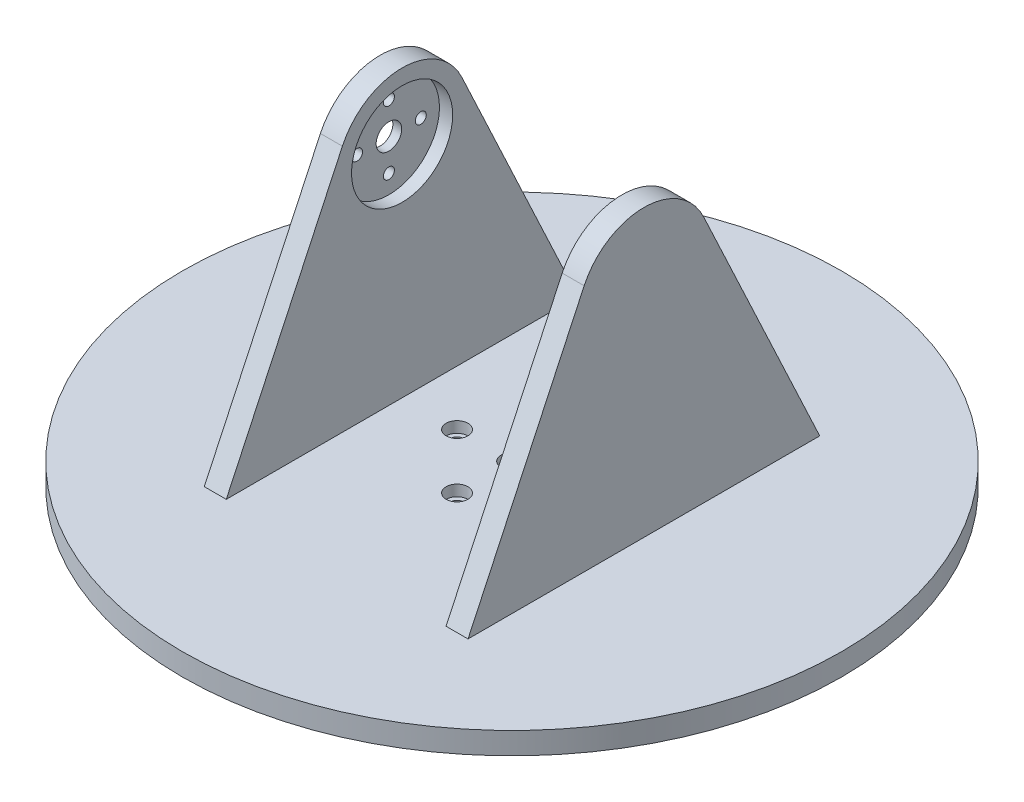
ISO-10303-21;
HEADER;
FILE_DESCRIPTION(('STEP AP214'),'2;1');
FILE_NAME('part.step','',(''),(''),'','','');
FILE_SCHEMA(('AUTOMOTIVE_DESIGN { 1 0 10303 214 1 1 1 1 }'));
ENDSEC;
DATA;
#1=APPLICATION_CONTEXT('core data for automotive mechanical design processes');
#2=APPLICATION_PROTOCOL_DEFINITION('international standard','automotive_design',2000,#1);
#3=PRODUCT_CONTEXT('',#1,'mechanical');
#4=PRODUCT('Part','Part','',(#3));
#5=PRODUCT_RELATED_PRODUCT_CATEGORY('part','',(#4));
#6=PRODUCT_DEFINITION_FORMATION('','',#4);
#7=PRODUCT_DEFINITION_CONTEXT('part definition',#1,'design');
#8=PRODUCT_DEFINITION('design','',#6,#7);
#9=PRODUCT_DEFINITION_SHAPE('','',#8);
#10=(LENGTH_UNIT() NAMED_UNIT(*) SI_UNIT(.MILLI.,.METRE.));
#11=(NAMED_UNIT(*) PLANE_ANGLE_UNIT() SI_UNIT($,.RADIAN.));
#12=(NAMED_UNIT(*) SI_UNIT($,.STERADIAN.) SOLID_ANGLE_UNIT());
#13=UNCERTAINTY_MEASURE_WITH_UNIT(LENGTH_MEASURE(1.E-05),#10,'distance_accuracy_value','');
#14=(GEOMETRIC_REPRESENTATION_CONTEXT(3) GLOBAL_UNCERTAINTY_ASSIGNED_CONTEXT((#13)) GLOBAL_UNIT_ASSIGNED_CONTEXT((#10,
#11,#12)) REPRESENTATION_CONTEXT('',''));
#15=CARTESIAN_POINT('',(0.,0.,0.));
#16=DIRECTION('',(0.,0.,1.));
#17=DIRECTION('',(1.,0.,0.));
#18=AXIS2_PLACEMENT_3D('',#15,#16,#17);
#19=CARTESIAN_POINT('',(-27.5,55.,0.));
#20=DIRECTION('',(-1.,0.,0.));
#21=DIRECTION('',(0.,0.,1.));
#22=AXIS2_PLACEMENT_3D('',#19,#20,#21);
#23=CYLINDRICAL_SURFACE('',#22,2.9);
#24=CARTESIAN_POINT('',(-30.,55.,0.));
#25=DIRECTION('',(-1.,0.,0.));
#26=DIRECTION('',(0.,0.,1.));
#27=AXIS2_PLACEMENT_3D('',#24,#25,#26);
#28=CIRCLE('',#27,2.9);
#29=CARTESIAN_POINT('',(-30.,55.,2.9));
#30=VERTEX_POINT('',#29);
#31=EDGE_CURVE('E133',#30,#30,#28,.T.);
#32=ORIENTED_EDGE('',*,*,#31,.T.);
#33=EDGE_LOOP('',(#32));
#34=FACE_BOUND('',#33,.T.);
#35=CARTESIAN_POINT('',(-28.,55.,0.));
#36=DIRECTION('',(1.,0.,0.));
#37=DIRECTION('',(0.,0.,-1.));
#38=AXIS2_PLACEMENT_3D('',#35,#36,#37);
#39=CIRCLE('',#38,2.9);
#40=CARTESIAN_POINT('',(-28.,55.,-2.9));
#41=VERTEX_POINT('',#40);
#42=EDGE_CURVE('E206',#41,#41,#39,.F.);
#43=ORIENTED_EDGE('',*,*,#42,.F.);
#44=EDGE_LOOP('',(#43));
#45=FACE_BOUND('',#44,.T.);
#46=ADVANCED_FACE('F39',(#34,#45),#23,.F.);
#47=CARTESIAN_POINT('',(-27.,62.25,0.));
#48=DIRECTION('',(-1.,0.,0.));
#49=DIRECTION('',(0.,0.,1.));
#50=AXIS2_PLACEMENT_3D('',#47,#48,#49);
#51=CYLINDRICAL_SURFACE('',#50,1.25);
#52=CARTESIAN_POINT('',(-30.,62.25,0.));
#53=DIRECTION('',(-1.,0.,0.));
#54=DIRECTION('',(0.,0.,1.));
#55=AXIS2_PLACEMENT_3D('',#52,#53,#54);
#56=CIRCLE('',#55,1.25);
#57=CARTESIAN_POINT('',(-30.,62.25,1.25));
#58=VERTEX_POINT('',#57);
#59=EDGE_CURVE('E247',#58,#58,#56,.T.);
#60=ORIENTED_EDGE('',*,*,#59,.T.);
#61=EDGE_LOOP('',(#60));
#62=FACE_BOUND('',#61,.T.);
#63=CARTESIAN_POINT('',(-28.,62.25,0.));
#64=DIRECTION('',(1.,0.,0.));
#65=DIRECTION('',(0.,0.,-1.));
#66=AXIS2_PLACEMENT_3D('',#63,#64,#65);
#67=CIRCLE('',#66,1.25);
#68=CARTESIAN_POINT('',(-28.,62.25,-1.25));
#69=VERTEX_POINT('',#68);
#70=EDGE_CURVE('E554',#69,#69,#67,.F.);
#71=ORIENTED_EDGE('',*,*,#70,.F.);
#72=EDGE_LOOP('',(#71));
#73=FACE_BOUND('',#72,.T.);
#74=ADVANCED_FACE('F296',(#62,#73),#51,.F.);
#75=CARTESIAN_POINT('',(-27.,55.,-7.25));
#76=DIRECTION('',(-1.,0.,0.));
#77=DIRECTION('',(0.,0.,1.));
#78=AXIS2_PLACEMENT_3D('',#75,#76,#77);
#79=CYLINDRICAL_SURFACE('',#78,1.25);
#80=CARTESIAN_POINT('',(-30.,55.,-7.25));
#81=DIRECTION('',(-1.,0.,0.));
#82=DIRECTION('',(0.,1.,0.));
#83=AXIS2_PLACEMENT_3D('',#80,#81,#82);
#84=CIRCLE('',#83,1.25);
#85=CARTESIAN_POINT('',(-30.,56.25,-7.25));
#86=VERTEX_POINT('',#85);
#87=EDGE_CURVE('E244',#86,#86,#84,.T.);
#88=ORIENTED_EDGE('',*,*,#87,.T.);
#89=EDGE_LOOP('',(#88));
#90=FACE_BOUND('',#89,.T.);
#91=CARTESIAN_POINT('',(-28.,55.,-7.25));
#92=DIRECTION('',(1.,0.,0.));
#93=DIRECTION('',(0.,0.,-1.));
#94=AXIS2_PLACEMENT_3D('',#91,#92,#93);
#95=CIRCLE('',#94,1.25);
#96=CARTESIAN_POINT('',(-28.,55.,-8.5));
#97=VERTEX_POINT('',#96);
#98=EDGE_CURVE('E551',#97,#97,#95,.F.);
#99=ORIENTED_EDGE('',*,*,#98,.F.);
#100=EDGE_LOOP('',(#99));
#101=FACE_BOUND('',#100,.T.);
#102=ADVANCED_FACE('F302',(#90,#101),#79,.F.);
#103=CARTESIAN_POINT('',(-27.,47.75,0.));
#104=DIRECTION('',(-1.,0.,0.));
#105=DIRECTION('',(0.,0.,1.));
#106=AXIS2_PLACEMENT_3D('',#103,#104,#105);
#107=CYLINDRICAL_SURFACE('',#106,1.25);
#108=CARTESIAN_POINT('',(-30.,47.75,0.));
#109=DIRECTION('',(-1.,0.,0.));
#110=DIRECTION('',(0.,0.,-1.));
#111=AXIS2_PLACEMENT_3D('',#108,#109,#110);
#112=CIRCLE('',#111,1.25);
#113=CARTESIAN_POINT('',(-30.,47.75,-1.25));
#114=VERTEX_POINT('',#113);
#115=EDGE_CURVE('E248',#114,#114,#112,.T.);
#116=ORIENTED_EDGE('',*,*,#115,.T.);
#117=EDGE_LOOP('',(#116));
#118=FACE_BOUND('',#117,.T.);
#119=CARTESIAN_POINT('',(-28.,47.75,0.));
#120=DIRECTION('',(1.,0.,0.));
#121=DIRECTION('',(0.,0.,-1.));
#122=AXIS2_PLACEMENT_3D('',#119,#120,#121);
#123=CIRCLE('',#122,1.25);
#124=CARTESIAN_POINT('',(-28.,47.75,-1.25));
#125=VERTEX_POINT('',#124);
#126=EDGE_CURVE('E549',#125,#125,#123,.F.);
#127=ORIENTED_EDGE('',*,*,#126,.F.);
#128=EDGE_LOOP('',(#127));
#129=FACE_BOUND('',#128,.T.);
#130=ADVANCED_FACE('F496',(#118,#129),#107,.F.);
#131=CARTESIAN_POINT('',(-27.,55.0000000000001,7.25));
#132=DIRECTION('',(-1.,0.,0.));
#133=DIRECTION('',(0.,0.,1.));
#134=AXIS2_PLACEMENT_3D('',#131,#132,#133);
#135=CYLINDRICAL_SURFACE('',#134,1.25);
#136=CARTESIAN_POINT('',(-30.,55.0000000000001,7.25));
#137=DIRECTION('',(-1.,0.,0.));
#138=DIRECTION('',(0.,-1.,0.));
#139=AXIS2_PLACEMENT_3D('',#136,#137,#138);
#140=CIRCLE('',#139,1.25);
#141=CARTESIAN_POINT('',(-30.,53.7500000000001,7.25000000000001));
#142=VERTEX_POINT('',#141);
#143=EDGE_CURVE('E242',#142,#142,#140,.T.);
#144=ORIENTED_EDGE('',*,*,#143,.T.);
#145=EDGE_LOOP('',(#144));
#146=FACE_BOUND('',#145,.T.);
#147=CARTESIAN_POINT('',(-28.,55.0000000000001,7.25));
#148=DIRECTION('',(1.,0.,0.));
#149=DIRECTION('',(0.,0.,-1.));
#150=AXIS2_PLACEMENT_3D('',#147,#148,#149);
#151=CIRCLE('',#150,1.25);
#152=CARTESIAN_POINT('',(-28.,55.0000000000001,6.));
#153=VERTEX_POINT('',#152);
#154=EDGE_CURVE('E43',#153,#153,#151,.F.);
#155=ORIENTED_EDGE('',*,*,#154,.F.);
#156=EDGE_LOOP('',(#155));
#157=FACE_BOUND('',#156,.T.);
#158=ADVANCED_FACE('F465',(#146,#157),#135,.F.);
#159=CARTESIAN_POINT('',(0.,0.,0.));
#160=DIRECTION('',(0.,1.,0.));
#161=DIRECTION('',(0.,0.,1.));
#162=AXIS2_PLACEMENT_3D('',#159,#160,#161);
#163=CYLINDRICAL_SURFACE('',#162,1.5);
#164=CARTESIAN_POINT('',(0.,0.,0.));
#165=DIRECTION('',(0.,1.,0.));
#166=DIRECTION('',(0.,0.,1.));
#167=AXIS2_PLACEMENT_3D('',#164,#165,#166);
#168=CIRCLE('',#167,1.5);
#169=CARTESIAN_POINT('',(0.,0.,1.5));
#170=VERTEX_POINT('',#169);
#171=EDGE_CURVE('E241',#170,#170,#168,.T.);
#172=ORIENTED_EDGE('',*,*,#171,.F.);
#173=EDGE_LOOP('',(#172));
#174=FACE_BOUND('',#173,.T.);
#175=CARTESIAN_POINT('',(0.,2.5,0.));
#176=DIRECTION('',(0.,1.,0.));
#177=DIRECTION('',(0.,0.,1.));
#178=AXIS2_PLACEMENT_3D('',#175,#176,#177);
#179=CIRCLE('',#178,1.5);
#180=CARTESIAN_POINT('',(0.,2.5,1.5));
#181=VERTEX_POINT('',#180);
#182=EDGE_CURVE('E195',#181,#181,#179,.F.);
#183=ORIENTED_EDGE('',*,*,#182,.F.);
#184=EDGE_LOOP('',(#183));
#185=FACE_BOUND('',#184,.T.);
#186=ADVANCED_FACE('F389',(#174,#185),#163,.F.);
#187=CARTESIAN_POINT('',(12.5,0.,-1.30930550206618E-13));
#188=DIRECTION('',(0.,1.,0.));
#189=DIRECTION('',(0.,0.,1.));
#190=AXIS2_PLACEMENT_3D('',#187,#188,#189);
#191=CYLINDRICAL_SURFACE('',#190,1.5);
#192=CARTESIAN_POINT('',(12.5,0.,-1.30930550206618E-13));
#193=DIRECTION('',(0.,1.,0.));
#194=DIRECTION('',(-1.,0.,0.));
#195=AXIS2_PLACEMENT_3D('',#192,#193,#194);
#196=CIRCLE('',#195,1.5);
#197=CARTESIAN_POINT('',(11.,0.,-1.15218884181823E-13));
#198=VERTEX_POINT('',#197);
#199=EDGE_CURVE('E181',#198,#198,#196,.T.);
#200=ORIENTED_EDGE('',*,*,#199,.F.);
#201=EDGE_LOOP('',(#200));
#202=FACE_BOUND('',#201,.T.);
#203=CARTESIAN_POINT('',(12.5,2.5,-1.30930550206618E-13));
#204=DIRECTION('',(0.,1.,0.));
#205=DIRECTION('',(0.,0.,1.));
#206=AXIS2_PLACEMENT_3D('',#203,#204,#205);
#207=CIRCLE('',#206,1.5);
#208=CARTESIAN_POINT('',(12.5,2.5,1.49999999999987));
#209=VERTEX_POINT('',#208);
#210=EDGE_CURVE('E188',#209,#209,#207,.F.);
#211=ORIENTED_EDGE('',*,*,#210,.F.);
#212=EDGE_LOOP('',(#211));
#213=FACE_BOUND('',#212,.T.);
#214=ADVANCED_FACE('F382',(#202,#213),#191,.F.);
#215=CARTESIAN_POINT('',(0.,0.,12.5));
#216=DIRECTION('',(0.,1.,0.));
#217=DIRECTION('',(0.,0.,1.));
#218=AXIS2_PLACEMENT_3D('',#215,#216,#217);
#219=CYLINDRICAL_SURFACE('',#218,1.5);
#220=CARTESIAN_POINT('',(0.,0.,12.5));
#221=DIRECTION('',(0.,1.,0.));
#222=DIRECTION('',(0.,0.,-1.));
#223=AXIS2_PLACEMENT_3D('',#220,#221,#222);
#224=CIRCLE('',#223,1.5);
#225=CARTESIAN_POINT('',(0.,0.,11.));
#226=VERTEX_POINT('',#225);
#227=EDGE_CURVE('E234',#226,#226,#224,.T.);
#228=ORIENTED_EDGE('',*,*,#227,.F.);
#229=EDGE_LOOP('',(#228));
#230=FACE_BOUND('',#229,.T.);
#231=CARTESIAN_POINT('',(0.,2.5,12.5));
#232=DIRECTION('',(0.,1.,0.));
#233=DIRECTION('',(0.,0.,1.));
#234=AXIS2_PLACEMENT_3D('',#231,#232,#233);
#235=CIRCLE('',#234,1.5);
#236=CARTESIAN_POINT('',(0.,2.5,14.));
#237=VERTEX_POINT('',#236);
#238=EDGE_CURVE('E187',#237,#237,#235,.F.);
#239=ORIENTED_EDGE('',*,*,#238,.F.);
#240=EDGE_LOOP('',(#239));
#241=FACE_BOUND('',#240,.T.);
#242=ADVANCED_FACE('F383',(#230,#241),#219,.F.);
#243=CARTESIAN_POINT('',(-12.5,0.,0.));
#244=DIRECTION('',(0.,1.,0.));
#245=DIRECTION('',(0.,0.,1.));
#246=AXIS2_PLACEMENT_3D('',#243,#244,#245);
#247=CYLINDRICAL_SURFACE('',#246,1.5);
#248=CARTESIAN_POINT('',(-12.5,0.,0.));
#249=DIRECTION('',(0.,1.,0.));
#250=DIRECTION('',(1.,0.,0.));
#251=AXIS2_PLACEMENT_3D('',#248,#249,#250);
#252=CIRCLE('',#251,1.5);
#253=CARTESIAN_POINT('',(-11.,0.,0.));
#254=VERTEX_POINT('',#253);
#255=EDGE_CURVE('E229',#254,#254,#252,.T.);
#256=ORIENTED_EDGE('',*,*,#255,.F.);
#257=EDGE_LOOP('',(#256));
#258=FACE_BOUND('',#257,.T.);
#259=CARTESIAN_POINT('',(-12.5,2.5,0.));
#260=DIRECTION('',(0.,1.,0.));
#261=DIRECTION('',(0.,0.,1.));
#262=AXIS2_PLACEMENT_3D('',#259,#260,#261);
#263=CIRCLE('',#262,1.5);
#264=CARTESIAN_POINT('',(-12.5,2.5,1.50000000000004));
#265=VERTEX_POINT('',#264);
#266=EDGE_CURVE('E182',#265,#265,#263,.F.);
#267=ORIENTED_EDGE('',*,*,#266,.F.);
#268=EDGE_LOOP('',(#267));
#269=FACE_BOUND('',#268,.T.);
#270=ADVANCED_FACE('F356',(#258,#269),#247,.F.);
#271=CARTESIAN_POINT('',(0.,0.,-12.5));
#272=DIRECTION('',(0.,1.,0.));
#273=DIRECTION('',(0.,0.,1.));
#274=AXIS2_PLACEMENT_3D('',#271,#272,#273);
#275=CYLINDRICAL_SURFACE('',#274,1.5);
#276=CARTESIAN_POINT('',(0.,0.,-12.5));
#277=DIRECTION('',(0.,1.,0.));
#278=DIRECTION('',(0.,0.,1.));
#279=AXIS2_PLACEMENT_3D('',#276,#277,#278);
#280=CIRCLE('',#279,1.5);
#281=CARTESIAN_POINT('',(0.,0.,-11.));
#282=VERTEX_POINT('',#281);
#283=EDGE_CURVE('E231',#282,#282,#280,.T.);
#284=ORIENTED_EDGE('',*,*,#283,.F.);
#285=EDGE_LOOP('',(#284));
#286=FACE_BOUND('',#285,.T.);
#287=CARTESIAN_POINT('',(0.,2.5,-12.5));
#288=DIRECTION('',(0.,1.,0.));
#289=DIRECTION('',(0.,0.,1.));
#290=AXIS2_PLACEMENT_3D('',#287,#288,#289);
#291=CIRCLE('',#290,1.5);
#292=CARTESIAN_POINT('',(0.,2.5,-11.));
#293=VERTEX_POINT('',#292);
#294=EDGE_CURVE('E178',#293,#293,#291,.F.);
#295=ORIENTED_EDGE('',*,*,#294,.F.);
#296=EDGE_LOOP('',(#295));
#297=FACE_BOUND('',#296,.T.);
#298=ADVANCED_FACE('F352',(#286,#297),#275,.F.);
#299=CARTESIAN_POINT('',(0.,5.,0.));
#300=DIRECTION('',(0.,1.,0.));
#301=DIRECTION('',(0.,0.,1.));
#302=AXIS2_PLACEMENT_3D('',#299,#300,#301);
#303=PLANE('',#302);
#304=CARTESIAN_POINT('',(0.,5.,0.));
#305=DIRECTION('',(0.,1.,0.));
#306=DIRECTION('',(0.,0.,1.));
#307=AXIS2_PLACEMENT_3D('',#304,#305,#306);
#308=CIRCLE('',#307,2.46109226377191);
#309=CARTESIAN_POINT('',(0.,5.,2.46109226377191));
#310=VERTEX_POINT('',#309);
#311=EDGE_CURVE('E203',#310,#310,#308,.T.);
#312=ORIENTED_EDGE('',*,*,#311,.F.);
#313=EDGE_LOOP('',(#312));
#314=FACE_BOUND('',#313,.T.);
#315=CARTESIAN_POINT('',(-12.5,5.,0.));
#316=DIRECTION('',(0.,1.,0.));
#317=DIRECTION('',(1.,0.,0.));
#318=AXIS2_PLACEMENT_3D('',#315,#316,#317);
#319=CIRCLE('',#318,2.48826211207155);
#320=CARTESIAN_POINT('',(-10.0117378879285,5.,0.));
#321=VERTEX_POINT('',#320);
#322=EDGE_CURVE('E212',#321,#321,#319,.T.);
#323=ORIENTED_EDGE('',*,*,#322,.F.);
#324=EDGE_LOOP('',(#323));
#325=FACE_BOUND('',#324,.T.);
#326=CARTESIAN_POINT('',(0.,5.,12.5));
#327=DIRECTION('',(0.,1.,0.));
#328=DIRECTION('',(0.,0.,-1.));
#329=AXIS2_PLACEMENT_3D('',#326,#327,#328);
#330=CIRCLE('',#329,2.48826211207155);
#331=CARTESIAN_POINT('',(0.,5.,10.0117378879285));
#332=VERTEX_POINT('',#331);
#333=EDGE_CURVE('E221',#332,#332,#330,.T.);
#334=ORIENTED_EDGE('',*,*,#333,.F.);
#335=EDGE_LOOP('',(#334));
#336=FACE_BOUND('',#335,.T.);
#337=CARTESIAN_POINT('',(12.5,5.,-1.30930550206618E-13));
#338=DIRECTION('',(0.,1.,0.));
#339=DIRECTION('',(-1.,0.,0.));
#340=AXIS2_PLACEMENT_3D('',#337,#338,#339);
#341=CIRCLE('',#340,2.48826211207155);
#342=CARTESIAN_POINT('',(10.0117378879285,5.,-1.04867388015273E-13));
#343=VERTEX_POINT('',#342);
#344=EDGE_CURVE('E192',#343,#343,#341,.T.);
#345=ORIENTED_EDGE('',*,*,#344,.F.);
#346=EDGE_LOOP('',(#345));
#347=FACE_BOUND('',#346,.T.);
#348=CARTESIAN_POINT('',(0.,5.,-12.5));
#349=DIRECTION('',(0.,1.,0.));
#350=DIRECTION('',(0.,0.,1.));
#351=AXIS2_PLACEMENT_3D('',#348,#349,#350);
#352=CIRCLE('',#351,2.48826211207155);
#353=CARTESIAN_POINT('',(0.,5.,-10.0117378879285));
#354=VERTEX_POINT('',#353);
#355=EDGE_CURVE('E191',#354,#354,#352,.T.);
#356=ORIENTED_EDGE('',*,*,#355,.F.);
#357=EDGE_LOOP('',(#356));
#358=FACE_BOUND('',#357,.T.);
#359=CARTESIAN_POINT('',(0.,5.,0.));
#360=DIRECTION('',(0.,1.,0.));
#361=DIRECTION('',(0.,0.,1.));
#362=AXIS2_PLACEMENT_3D('',#359,#360,#361);
#363=CIRCLE('',#362,75.);
#364=CARTESIAN_POINT('',(0.,5.,75.));
#365=VERTEX_POINT('',#364);
#366=EDGE_CURVE('E11',#365,#365,#363,.T.);
#367=ORIENTED_EDGE('',*,*,#366,.T.);
#368=EDGE_LOOP('',(#367));
#369=FACE_BOUND('',#368,.T.);
#370=DIRECTION('',(1.,0.,0.));
#371=VECTOR('',#370,1.);
#372=CARTESIAN_POINT('',(-30.,5.,-40.));
#373=LINE('',#372,#371);
#374=CARTESIAN_POINT('',(-30.,5.,-40.));
#375=VERTEX_POINT('',#374);
#376=CARTESIAN_POINT('',(-25.,5.,-40.));
#377=VERTEX_POINT('',#376);
#378=EDGE_CURVE('E167',#375,#377,#373,.T.);
#379=ORIENTED_EDGE('',*,*,#378,.T.);
#380=DIRECTION('',(0.,0.,1.));
#381=VECTOR('',#380,1.);
#382=CARTESIAN_POINT('',(-25.,5.,-40.));
#383=LINE('',#382,#381);
#384=CARTESIAN_POINT('',(-25.,5.,40.));
#385=VERTEX_POINT('',#384);
#386=EDGE_CURVE('E162',#377,#385,#383,.T.);
#387=ORIENTED_EDGE('',*,*,#386,.T.);
#388=DIRECTION('',(1.,0.,0.));
#389=VECTOR('',#388,1.);
#390=CARTESIAN_POINT('',(-30.,5.,40.));
#391=LINE('',#390,#389);
#392=CARTESIAN_POINT('',(-30.,5.,40.));
#393=VERTEX_POINT('',#392);
#394=EDGE_CURVE('E166',#393,#385,#391,.T.);
#395=ORIENTED_EDGE('',*,*,#394,.F.);
#396=DIRECTION('',(0.,0.,1.));
#397=VECTOR('',#396,1.);
#398=CARTESIAN_POINT('',(-30.,5.,-40.));
#399=LINE('',#398,#397);
#400=EDGE_CURVE('E154',#375,#393,#399,.T.);
#401=ORIENTED_EDGE('',*,*,#400,.F.);
#402=EDGE_LOOP('',(#379,#387,#395,#401));
#403=FACE_BOUND('',#402,.T.);
#404=DIRECTION('',(-1.,0.,0.));
#405=VECTOR('',#404,1.);
#406=CARTESIAN_POINT('',(30.,5.,-40.));
#407=LINE('',#406,#405);
#408=CARTESIAN_POINT('',(30.,5.,-40.));
#409=VERTEX_POINT('',#408);
#410=CARTESIAN_POINT('',(25.,5.,-40.));
#411=VERTEX_POINT('',#410);
#412=EDGE_CURVE('E64',#409,#411,#407,.T.);
#413=ORIENTED_EDGE('',*,*,#412,.F.);
#414=DIRECTION('',(0.,0.,1.));
#415=VECTOR('',#414,1.);
#416=CARTESIAN_POINT('',(30.,5.,40.));
#417=LINE('',#416,#415);
#418=CARTESIAN_POINT('',(30.,5.,40.));
#419=VERTEX_POINT('',#418);
#420=EDGE_CURVE('E57',#409,#419,#417,.T.);
#421=ORIENTED_EDGE('',*,*,#420,.T.);
#422=DIRECTION('',(-1.,0.,0.));
#423=VECTOR('',#422,1.);
#424=CARTESIAN_POINT('',(30.,5.,40.));
#425=LINE('',#424,#423);
#426=CARTESIAN_POINT('',(25.,5.,40.));
#427=VERTEX_POINT('',#426);
#428=EDGE_CURVE('E141',#419,#427,#425,.T.);
#429=ORIENTED_EDGE('',*,*,#428,.T.);
#430=DIRECTION('',(0.,0.,1.));
#431=VECTOR('',#430,1.);
#432=CARTESIAN_POINT('',(25.,5.,40.));
#433=LINE('',#432,#431);
#434=EDGE_CURVE('E130',#411,#427,#433,.T.);
#435=ORIENTED_EDGE('',*,*,#434,.F.);
#436=EDGE_LOOP('',(#413,#421,#429,#435));
#437=FACE_BOUND('',#436,.T.);
#438=ADVANCED_FACE('F283',(#314,#325,#336,#347,#358,#369,#403,#437),#303,.T.);
#439=CARTESIAN_POINT('',(0.,5.,0.));
#440=DIRECTION('',(0.,-1.,0.));
#441=DIRECTION('',(0.,0.,-1.));
#442=AXIS2_PLACEMENT_3D('',#439,#440,#441);
#443=CYLINDRICAL_SURFACE('',#442,75.);
#444=ORIENTED_EDGE('',*,*,#366,.F.);
#445=EDGE_LOOP('',(#444));
#446=FACE_BOUND('',#445,.T.);
#447=CARTESIAN_POINT('',(0.,0.,0.));
#448=DIRECTION('',(0.,1.,0.));
#449=DIRECTION('',(0.,0.,1.));
#450=AXIS2_PLACEMENT_3D('',#447,#448,#449);
#451=CIRCLE('',#450,75.);
#452=CARTESIAN_POINT('',(0.,0.,75.));
#453=VERTEX_POINT('',#452);
#454=EDGE_CURVE('E48',#453,#453,#451,.T.);
#455=ORIENTED_EDGE('',*,*,#454,.T.);
#456=EDGE_LOOP('',(#455));
#457=FACE_BOUND('',#456,.T.);
#458=ADVANCED_FACE('F41',(#446,#457),#443,.T.);
#459=CARTESIAN_POINT('',(0.,0.,0.));
#460=DIRECTION('',(0.,1.,0.));
#461=DIRECTION('',(0.,0.,1.));
#462=AXIS2_PLACEMENT_3D('',#459,#460,#461);
#463=PLANE('',#462);
#464=ORIENTED_EDGE('',*,*,#255,.T.);
#465=EDGE_LOOP('',(#464));
#466=FACE_BOUND('',#465,.T.);
#467=ORIENTED_EDGE('',*,*,#227,.T.);
#468=EDGE_LOOP('',(#467));
#469=FACE_BOUND('',#468,.T.);
#470=ORIENTED_EDGE('',*,*,#199,.T.);
#471=EDGE_LOOP('',(#470));
#472=FACE_BOUND('',#471,.T.);
#473=ORIENTED_EDGE('',*,*,#283,.T.);
#474=EDGE_LOOP('',(#473));
#475=FACE_BOUND('',#474,.T.);
#476=ORIENTED_EDGE('',*,*,#171,.T.);
#477=EDGE_LOOP('',(#476));
#478=FACE_BOUND('',#477,.T.);
#479=ORIENTED_EDGE('',*,*,#454,.F.);
#480=EDGE_LOOP('',(#479));
#481=FACE_BOUND('',#480,.T.);
#482=ADVANCED_FACE('F343',(#466,#469,#472,#475,#478,#481),#463,.F.);
#483=CARTESIAN_POINT('',(-30.,55.,0.));
#484=DIRECTION('',(1.,0.,0.));
#485=DIRECTION('',(0.,0.,-1.));
#486=AXIS2_PLACEMENT_3D('',#483,#484,#485);
#487=CYLINDRICAL_SURFACE('',#486,15.);
#488=CARTESIAN_POINT('',(-25.,55.,0.));
#489=DIRECTION('',(-1.,0.,0.));
#490=DIRECTION('',(0.,0.,1.));
#491=AXIS2_PLACEMENT_3D('',#488,#489,#490);
#492=CIRCLE('',#491,15.);
#493=CARTESIAN_POINT('',(-25.,61.3657801936503,13.5822252420629));
#494=VERTEX_POINT('',#493);
#495=CARTESIAN_POINT('',(-25.,61.3657801936503,-13.5822252420629));
#496=VERTEX_POINT('',#495);
#497=EDGE_CURVE('E145',#494,#496,#492,.T.);
#498=ORIENTED_EDGE('',*,*,#497,.T.);
#499=DIRECTION('',(1.,0.,0.));
#500=VECTOR('',#499,1.);
#501=CARTESIAN_POINT('',(-30.,61.3657801936503,-13.5822252420629));
#502=LINE('',#501,#500);
#503=CARTESIAN_POINT('',(-30.,61.3657801936503,-13.5822252420629));
#504=VERTEX_POINT('',#503);
#505=EDGE_CURVE('E173',#504,#496,#502,.T.);
#506=ORIENTED_EDGE('',*,*,#505,.F.);
#507=CARTESIAN_POINT('',(-30.,55.,0.));
#508=DIRECTION('',(-1.,0.,0.));
#509=DIRECTION('',(0.,0.,1.));
#510=AXIS2_PLACEMENT_3D('',#507,#508,#509);
#511=CIRCLE('',#510,15.);
#512=CARTESIAN_POINT('',(-30.,61.3657801936503,13.5822252420629));
#513=VERTEX_POINT('',#512);
#514=EDGE_CURVE('E149',#513,#504,#511,.T.);
#515=ORIENTED_EDGE('',*,*,#514,.F.);
#516=DIRECTION('',(1.,0.,0.));
#517=VECTOR('',#516,1.);
#518=CARTESIAN_POINT('',(-30.,61.3657801936503,13.5822252420629));
#519=LINE('',#518,#517);
#520=EDGE_CURVE('E156',#513,#494,#519,.T.);
#521=ORIENTED_EDGE('',*,*,#520,.T.);
#522=EDGE_LOOP('',(#498,#506,#515,#521));
#523=FACE_BOUND('',#522,.T.);
#524=ADVANCED_FACE('F274',(#523),#487,.T.);
#525=CARTESIAN_POINT('',(-30.,61.3657801936503,-13.5822252420629));
#526=DIRECTION('',(0.,-0.424385346243353,0.905481682804191));
#527=DIRECTION('',(0.,-0.905481682804191,-0.424385346243353));
#528=AXIS2_PLACEMENT_3D('',#525,#526,#527);
#529=PLANE('',#528);
#530=DIRECTION('',(0.,-0.905481682804191,-0.424385346243353));
#531=VECTOR('',#530,1.);
#532=CARTESIAN_POINT('',(-25.,61.3657801936503,-13.5822252420629));
#533=LINE('',#532,#531);
#534=EDGE_CURVE('E157',#496,#377,#533,.T.);
#535=ORIENTED_EDGE('',*,*,#534,.T.);
#536=ORIENTED_EDGE('',*,*,#378,.F.);
#537=DIRECTION('',(0.,-0.905481682804191,-0.424385346243353));
#538=VECTOR('',#537,1.);
#539=CARTESIAN_POINT('',(-30.,61.3657801936503,-13.5822252420629));
#540=LINE('',#539,#538);
#541=EDGE_CURVE('E148',#504,#375,#540,.T.);
#542=ORIENTED_EDGE('',*,*,#541,.F.);
#543=ORIENTED_EDGE('',*,*,#505,.T.);
#544=EDGE_LOOP('',(#535,#536,#542,#543));
#545=FACE_BOUND('',#544,.T.);
#546=ADVANCED_FACE('F276',(#545),#529,.F.);
#547=CARTESIAN_POINT('',(-30.,61.3657801936503,13.5822252420629));
#548=DIRECTION('',(0.,-0.424385346243353,-0.905481682804191));
#549=DIRECTION('',(0.,0.905481682804191,-0.424385346243353));
#550=AXIS2_PLACEMENT_3D('',#547,#548,#549);
#551=PLANE('',#550);
#552=DIRECTION('',(0.,0.905481682804191,-0.424385346243353));
#553=VECTOR('',#552,1.);
#554=CARTESIAN_POINT('',(-25.,61.3657801936503,13.5822252420629));
#555=LINE('',#554,#553);
#556=EDGE_CURVE('E147',#385,#494,#555,.T.);
#557=ORIENTED_EDGE('',*,*,#556,.T.);
#558=ORIENTED_EDGE('',*,*,#520,.F.);
#559=DIRECTION('',(0.,0.905481682804191,-0.424385346243353));
#560=VECTOR('',#559,1.);
#561=CARTESIAN_POINT('',(-30.,61.3657801936503,13.5822252420629));
#562=LINE('',#561,#560);
#563=EDGE_CURVE('E155',#393,#513,#562,.T.);
#564=ORIENTED_EDGE('',*,*,#563,.F.);
#565=ORIENTED_EDGE('',*,*,#394,.T.);
#566=EDGE_LOOP('',(#557,#558,#564,#565));
#567=FACE_BOUND('',#566,.T.);
#568=ADVANCED_FACE('F261',(#567),#551,.F.);
#569=CARTESIAN_POINT('',(-30.,55.,0.));
#570=DIRECTION('',(-1.,0.,0.));
#571=DIRECTION('',(0.,0.,1.));
#572=AXIS2_PLACEMENT_3D('',#569,#570,#571);
#573=PLANE('',#572);
#574=ORIENTED_EDGE('',*,*,#87,.F.);
#575=EDGE_LOOP('',(#574));
#576=FACE_BOUND('',#575,.T.);
#577=ORIENTED_EDGE('',*,*,#115,.F.);
#578=EDGE_LOOP('',(#577));
#579=FACE_BOUND('',#578,.T.);
#580=ORIENTED_EDGE('',*,*,#143,.F.);
#581=EDGE_LOOP('',(#580));
#582=FACE_BOUND('',#581,.T.);
#583=ORIENTED_EDGE('',*,*,#59,.F.);
#584=EDGE_LOOP('',(#583));
#585=FACE_BOUND('',#584,.T.);
#586=ORIENTED_EDGE('',*,*,#31,.F.);
#587=EDGE_LOOP('',(#586));
#588=FACE_BOUND('',#587,.T.);
#589=ORIENTED_EDGE('',*,*,#514,.T.);
#590=ORIENTED_EDGE('',*,*,#541,.T.);
#591=ORIENTED_EDGE('',*,*,#400,.T.);
#592=ORIENTED_EDGE('',*,*,#563,.T.);
#593=EDGE_LOOP('',(#589,#590,#591,#592));
#594=FACE_BOUND('',#593,.T.);
#595=ADVANCED_FACE('F263',(#576,#579,#582,#585,#588,#594),#573,.T.);
#596=CARTESIAN_POINT('',(-25.,55.,0.));
#597=DIRECTION('',(-1.,0.,0.));
#598=DIRECTION('',(0.,0.,1.));
#599=AXIS2_PLACEMENT_3D('',#596,#597,#598);
#600=PLANE('',#599);
#601=CARTESIAN_POINT('',(-25.,55.,0.));
#602=DIRECTION('',(1.,0.,0.));
#603=DIRECTION('',(0.,0.,-1.));
#604=AXIS2_PLACEMENT_3D('',#601,#602,#603);
#605=CIRCLE('',#604,11.5);
#606=CARTESIAN_POINT('',(-25.,55.,-11.5));
#607=VERTEX_POINT('',#606);
#608=EDGE_CURVE('E546',#607,#607,#605,.T.);
#609=ORIENTED_EDGE('',*,*,#608,.F.);
#610=EDGE_LOOP('',(#609));
#611=FACE_BOUND('',#610,.T.);
#612=ORIENTED_EDGE('',*,*,#497,.F.);
#613=ORIENTED_EDGE('',*,*,#556,.F.);
#614=ORIENTED_EDGE('',*,*,#386,.F.);
#615=ORIENTED_EDGE('',*,*,#534,.F.);
#616=EDGE_LOOP('',(#612,#613,#614,#615));
#617=FACE_BOUND('',#616,.T.);
#618=ADVANCED_FACE('F265',(#611,#617),#600,.F.);
#619=CARTESIAN_POINT('',(30.,55.,0.));
#620=DIRECTION('',(-1.,0.,0.));
#621=DIRECTION('',(0.,0.,1.));
#622=AXIS2_PLACEMENT_3D('',#619,#620,#621);
#623=CYLINDRICAL_SURFACE('',#622,15.);
#624=CARTESIAN_POINT('',(25.,55.,0.));
#625=DIRECTION('',(-1.,0.,0.));
#626=DIRECTION('',(0.,0.,1.));
#627=AXIS2_PLACEMENT_3D('',#624,#625,#626);
#628=CIRCLE('',#627,15.);
#629=CARTESIAN_POINT('',(25.,61.3657801936503,13.5822252420629));
#630=VERTEX_POINT('',#629);
#631=CARTESIAN_POINT('',(25.,61.3657801936503,-13.5822252420629));
#632=VERTEX_POINT('',#631);
#633=EDGE_CURVE('E136',#630,#632,#628,.T.);
#634=ORIENTED_EDGE('',*,*,#633,.F.);
#635=DIRECTION('',(-1.,0.,0.));
#636=VECTOR('',#635,1.);
#637=CARTESIAN_POINT('',(30.,61.3657801936503,13.5822252420629));
#638=LINE('',#637,#636);
#639=CARTESIAN_POINT('',(30.,61.3657801936503,13.5822252420629));
#640=VERTEX_POINT('',#639);
#641=EDGE_CURVE('E121',#640,#630,#638,.T.);
#642=ORIENTED_EDGE('',*,*,#641,.F.);
#643=CARTESIAN_POINT('',(30.,55.,0.));
#644=DIRECTION('',(-1.,0.,0.));
#645=DIRECTION('',(0.,0.,1.));
#646=AXIS2_PLACEMENT_3D('',#643,#644,#645);
#647=CIRCLE('',#646,15.);
#648=CARTESIAN_POINT('',(30.,61.3657801936503,-13.5822252420629));
#649=VERTEX_POINT('',#648);
#650=EDGE_CURVE('E119',#640,#649,#647,.T.);
#651=ORIENTED_EDGE('',*,*,#650,.T.);
#652=DIRECTION('',(-1.,0.,0.));
#653=VECTOR('',#652,1.);
#654=CARTESIAN_POINT('',(30.,61.3657801936503,-13.5822252420629));
#655=LINE('',#654,#653);
#656=EDGE_CURVE('E104',#649,#632,#655,.T.);
#657=ORIENTED_EDGE('',*,*,#656,.T.);
#658=EDGE_LOOP('',(#634,#642,#651,#657));
#659=FACE_BOUND('',#658,.T.);
#660=ADVANCED_FACE('F124',(#659),#623,.T.);
#661=CARTESIAN_POINT('',(30.,61.3657801936503,13.5822252420629));
#662=DIRECTION('',(0.,0.424385346243353,0.905481682804191));
#663=DIRECTION('',(0.,-0.905481682804191,0.424385346243353));
#664=AXIS2_PLACEMENT_3D('',#661,#662,#663);
#665=PLANE('',#664);
#666=DIRECTION('',(0.,0.905481682804191,-0.424385346243353));
#667=VECTOR('',#666,1.);
#668=CARTESIAN_POINT('',(25.,61.3657801936503,13.5822252420629));
#669=LINE('',#668,#667);
#670=EDGE_CURVE('E123',#427,#630,#669,.T.);
#671=ORIENTED_EDGE('',*,*,#670,.F.);
#672=ORIENTED_EDGE('',*,*,#428,.F.);
#673=DIRECTION('',(0.,0.905481682804191,-0.424385346243353));
#674=VECTOR('',#673,1.);
#675=CARTESIAN_POINT('',(30.,61.3657801936503,13.5822252420629));
#676=LINE('',#675,#674);
#677=EDGE_CURVE('E112',#419,#640,#676,.T.);
#678=ORIENTED_EDGE('',*,*,#677,.T.);
#679=ORIENTED_EDGE('',*,*,#641,.T.);
#680=EDGE_LOOP('',(#671,#672,#678,#679));
#681=FACE_BOUND('',#680,.T.);
#682=ADVANCED_FACE('F291',(#681),#665,.T.);
#683=CARTESIAN_POINT('',(30.,61.3657801936503,-13.5822252420629));
#684=DIRECTION('',(0.,0.424385346243353,-0.905481682804191));
#685=DIRECTION('',(0.,0.905481682804191,0.424385346243353));
#686=AXIS2_PLACEMENT_3D('',#683,#684,#685);
#687=PLANE('',#686);
#688=DIRECTION('',(0.,-0.905481682804191,-0.424385346243353));
#689=VECTOR('',#688,1.);
#690=CARTESIAN_POINT('',(25.,61.3657801936503,-13.5822252420629));
#691=LINE('',#690,#689);
#692=EDGE_CURVE('E107',#632,#411,#691,.T.);
#693=ORIENTED_EDGE('',*,*,#692,.F.);
#694=ORIENTED_EDGE('',*,*,#656,.F.);
#695=DIRECTION('',(0.,-0.905481682804191,-0.424385346243353));
#696=VECTOR('',#695,1.);
#697=CARTESIAN_POINT('',(30.,61.3657801936503,-13.5822252420629));
#698=LINE('',#697,#696);
#699=EDGE_CURVE('E110',#649,#409,#698,.T.);
#700=ORIENTED_EDGE('',*,*,#699,.T.);
#701=ORIENTED_EDGE('',*,*,#412,.T.);
#702=EDGE_LOOP('',(#693,#694,#700,#701));
#703=FACE_BOUND('',#702,.T.);
#704=ADVANCED_FACE('F106',(#703),#687,.T.);
#705=CARTESIAN_POINT('',(30.,55.,0.));
#706=DIRECTION('',(-1.,0.,0.));
#707=DIRECTION('',(0.,0.,1.));
#708=AXIS2_PLACEMENT_3D('',#705,#706,#707);
#709=PLANE('',#708);
#710=ORIENTED_EDGE('',*,*,#650,.F.);
#711=ORIENTED_EDGE('',*,*,#677,.F.);
#712=ORIENTED_EDGE('',*,*,#420,.F.);
#713=ORIENTED_EDGE('',*,*,#699,.F.);
#714=EDGE_LOOP('',(#710,#711,#712,#713));
#715=FACE_BOUND('',#714,.T.);
#716=ADVANCED_FACE('F117',(#715),#709,.F.);
#717=CARTESIAN_POINT('',(25.,55.,0.));
#718=DIRECTION('',(-1.,0.,0.));
#719=DIRECTION('',(0.,0.,1.));
#720=AXIS2_PLACEMENT_3D('',#717,#718,#719);
#721=PLANE('',#720);
#722=ORIENTED_EDGE('',*,*,#633,.T.);
#723=ORIENTED_EDGE('',*,*,#692,.T.);
#724=ORIENTED_EDGE('',*,*,#434,.T.);
#725=ORIENTED_EDGE('',*,*,#670,.T.);
#726=EDGE_LOOP('',(#722,#723,#724,#725));
#727=FACE_BOUND('',#726,.T.);
#728=ADVANCED_FACE('F309',(#727),#721,.T.);
#729=CARTESIAN_POINT('',(0.,2.5,-12.5));
#730=DIRECTION('',(0.,1.,0.));
#731=DIRECTION('',(0.,0.,1.));
#732=AXIS2_PLACEMENT_3D('',#729,#730,#731);
#733=PLANE('',#732);
#734=CARTESIAN_POINT('',(0.,2.5,-12.5));
#735=DIRECTION('',(0.,1.,0.));
#736=DIRECTION('',(0.,0.,1.));
#737=AXIS2_PLACEMENT_3D('',#734,#735,#736);
#738=CIRCLE('',#737,2.48826211207155);
#739=CARTESIAN_POINT('',(0.,2.5,-10.0117378879285));
#740=VERTEX_POINT('',#739);
#741=EDGE_CURVE('E185',#740,#740,#738,.T.);
#742=ORIENTED_EDGE('',*,*,#741,.T.);
#743=EDGE_LOOP('',(#742));
#744=FACE_BOUND('',#743,.T.);
#745=ORIENTED_EDGE('',*,*,#294,.T.);
#746=EDGE_LOOP('',(#745));
#747=FACE_BOUND('',#746,.T.);
#748=ADVANCED_FACE('F312',(#744,#747),#733,.T.);
#749=CARTESIAN_POINT('',(0.,2.5,-12.5));
#750=DIRECTION('',(0.,1.,0.));
#751=DIRECTION('',(0.,0.,1.));
#752=AXIS2_PLACEMENT_3D('',#749,#750,#751);
#753=CYLINDRICAL_SURFACE('',#752,2.48826211207155);
#754=ORIENTED_EDGE('',*,*,#741,.F.);
#755=EDGE_LOOP('',(#754));
#756=FACE_BOUND('',#755,.T.);
#757=ORIENTED_EDGE('',*,*,#355,.T.);
#758=EDGE_LOOP('',(#757));
#759=FACE_BOUND('',#758,.T.);
#760=ADVANCED_FACE('F366',(#756,#759),#753,.F.);
#761=CARTESIAN_POINT('',(-12.5,2.5,0.));
#762=DIRECTION('',(0.,1.,0.));
#763=DIRECTION('',(1.,0.,0.));
#764=AXIS2_PLACEMENT_3D('',#761,#762,#763);
#765=PLANE('',#764);
#766=CARTESIAN_POINT('',(-12.5,2.5,0.));
#767=DIRECTION('',(0.,1.,0.));
#768=DIRECTION('',(1.,0.,0.));
#769=AXIS2_PLACEMENT_3D('',#766,#767,#768);
#770=CIRCLE('',#769,2.48826211207155);
#771=CARTESIAN_POINT('',(-10.0117378879285,2.5,0.));
#772=VERTEX_POINT('',#771);
#773=EDGE_CURVE('E190',#772,#772,#770,.T.);
#774=ORIENTED_EDGE('',*,*,#773,.T.);
#775=EDGE_LOOP('',(#774));
#776=FACE_BOUND('',#775,.T.);
#777=ORIENTED_EDGE('',*,*,#266,.T.);
#778=EDGE_LOOP('',(#777));
#779=FACE_BOUND('',#778,.T.);
#780=ADVANCED_FACE('F372',(#776,#779),#765,.T.);
#781=CARTESIAN_POINT('',(-12.5,2.5,0.));
#782=DIRECTION('',(0.,1.,0.));
#783=DIRECTION('',(0.,0.,1.));
#784=AXIS2_PLACEMENT_3D('',#781,#782,#783);
#785=CYLINDRICAL_SURFACE('',#784,2.48826211207155);
#786=ORIENTED_EDGE('',*,*,#773,.F.);
#787=EDGE_LOOP('',(#786));
#788=FACE_BOUND('',#787,.T.);
#789=ORIENTED_EDGE('',*,*,#322,.T.);
#790=EDGE_LOOP('',(#789));
#791=FACE_BOUND('',#790,.T.);
#792=ADVANCED_FACE('F410',(#788,#791),#785,.F.);
#793=CARTESIAN_POINT('',(0.,2.5,12.5));
#794=DIRECTION('',(0.,1.,0.));
#795=DIRECTION('',(0.,0.,-1.));
#796=AXIS2_PLACEMENT_3D('',#793,#794,#795);
#797=PLANE('',#796);
#798=CARTESIAN_POINT('',(0.,2.5,12.5));
#799=DIRECTION('',(0.,1.,0.));
#800=DIRECTION('',(0.,0.,-1.));
#801=AXIS2_PLACEMENT_3D('',#798,#799,#800);
#802=CIRCLE('',#801,2.48826211207155);
#803=CARTESIAN_POINT('',(0.,2.5,10.0117378879285));
#804=VERTEX_POINT('',#803);
#805=EDGE_CURVE('E217',#804,#804,#802,.T.);
#806=ORIENTED_EDGE('',*,*,#805,.T.);
#807=EDGE_LOOP('',(#806));
#808=FACE_BOUND('',#807,.T.);
#809=ORIENTED_EDGE('',*,*,#238,.T.);
#810=EDGE_LOOP('',(#809));
#811=FACE_BOUND('',#810,.T.);
#812=ADVANCED_FACE('F416',(#808,#811),#797,.T.);
#813=CARTESIAN_POINT('',(0.,2.5,12.5));
#814=DIRECTION('',(0.,1.,0.));
#815=DIRECTION('',(0.,0.,1.));
#816=AXIS2_PLACEMENT_3D('',#813,#814,#815);
#817=CYLINDRICAL_SURFACE('',#816,2.48826211207155);
#818=ORIENTED_EDGE('',*,*,#805,.F.);
#819=EDGE_LOOP('',(#818));
#820=FACE_BOUND('',#819,.T.);
#821=ORIENTED_EDGE('',*,*,#333,.T.);
#822=EDGE_LOOP('',(#821));
#823=FACE_BOUND('',#822,.T.);
#824=ADVANCED_FACE('F424',(#820,#823),#817,.F.);
#825=CARTESIAN_POINT('',(12.5,2.5,-1.30930550206618E-13));
#826=DIRECTION('',(0.,1.,0.));
#827=DIRECTION('',(-1.,0.,0.));
#828=AXIS2_PLACEMENT_3D('',#825,#826,#827);
#829=PLANE('',#828);
#830=CARTESIAN_POINT('',(12.5,2.5,-1.30930550206618E-13));
#831=DIRECTION('',(0.,1.,0.));
#832=DIRECTION('',(-1.,0.,0.));
#833=AXIS2_PLACEMENT_3D('',#830,#831,#832);
#834=CIRCLE('',#833,2.48826211207155);
#835=CARTESIAN_POINT('',(10.0117378879285,2.5,-1.04867388015273E-13));
#836=VERTEX_POINT('',#835);
#837=EDGE_CURVE('E196',#836,#836,#834,.T.);
#838=ORIENTED_EDGE('',*,*,#837,.T.);
#839=EDGE_LOOP('',(#838));
#840=FACE_BOUND('',#839,.T.);
#841=ORIENTED_EDGE('',*,*,#210,.T.);
#842=EDGE_LOOP('',(#841));
#843=FACE_BOUND('',#842,.T.);
#844=ADVANCED_FACE('F432',(#840,#843),#829,.T.);
#845=CARTESIAN_POINT('',(12.5,2.5,-1.30930550206618E-13));
#846=DIRECTION('',(0.,1.,0.));
#847=DIRECTION('',(0.,0.,1.));
#848=AXIS2_PLACEMENT_3D('',#845,#846,#847);
#849=CYLINDRICAL_SURFACE('',#848,2.48826211207155);
#850=ORIENTED_EDGE('',*,*,#837,.F.);
#851=EDGE_LOOP('',(#850));
#852=FACE_BOUND('',#851,.T.);
#853=ORIENTED_EDGE('',*,*,#344,.T.);
#854=EDGE_LOOP('',(#853));
#855=FACE_BOUND('',#854,.T.);
#856=ADVANCED_FACE('F442',(#852,#855),#849,.F.);
#857=CARTESIAN_POINT('',(0.,2.5,0.));
#858=DIRECTION('',(0.,1.,0.));
#859=DIRECTION('',(0.,0.,1.));
#860=AXIS2_PLACEMENT_3D('',#857,#858,#859);
#861=PLANE('',#860);
#862=CARTESIAN_POINT('',(0.,2.5,0.));
#863=DIRECTION('',(0.,1.,0.));
#864=DIRECTION('',(0.,0.,1.));
#865=AXIS2_PLACEMENT_3D('',#862,#863,#864);
#866=CIRCLE('',#865,2.46109226377191);
#867=CARTESIAN_POINT('',(0.,2.5,2.46109226377191));
#868=VERTEX_POINT('',#867);
#869=EDGE_CURVE('E198',#868,#868,#866,.T.);
#870=ORIENTED_EDGE('',*,*,#869,.T.);
#871=EDGE_LOOP('',(#870));
#872=FACE_BOUND('',#871,.T.);
#873=ORIENTED_EDGE('',*,*,#182,.T.);
#874=EDGE_LOOP('',(#873));
#875=FACE_BOUND('',#874,.T.);
#876=ADVANCED_FACE('F451',(#872,#875),#861,.T.);
#877=CARTESIAN_POINT('',(0.,2.5,0.));
#878=DIRECTION('',(0.,1.,0.));
#879=DIRECTION('',(0.,0.,1.));
#880=AXIS2_PLACEMENT_3D('',#877,#878,#879);
#881=CYLINDRICAL_SURFACE('',#880,2.46109226377191);
#882=ORIENTED_EDGE('',*,*,#869,.F.);
#883=EDGE_LOOP('',(#882));
#884=FACE_BOUND('',#883,.T.);
#885=ORIENTED_EDGE('',*,*,#311,.T.);
#886=EDGE_LOOP('',(#885));
#887=FACE_BOUND('',#886,.T.);
#888=ADVANCED_FACE('F477',(#884,#887),#881,.F.);
#889=CARTESIAN_POINT('',(-28.,55.,0.));
#890=DIRECTION('',(1.,0.,0.));
#891=DIRECTION('',(0.,0.,-1.));
#892=AXIS2_PLACEMENT_3D('',#889,#890,#891);
#893=PLANE('',#892);
#894=CARTESIAN_POINT('',(-28.,55.,0.));
#895=DIRECTION('',(1.,0.,0.));
#896=DIRECTION('',(0.,0.,-1.));
#897=AXIS2_PLACEMENT_3D('',#894,#895,#896);
#898=CIRCLE('',#897,11.5);
#899=CARTESIAN_POINT('',(-28.,55.,-11.5));
#900=VERTEX_POINT('',#899);
#901=EDGE_CURVE('E545',#900,#900,#898,.T.);
#902=ORIENTED_EDGE('',*,*,#901,.T.);
#903=EDGE_LOOP('',(#902));
#904=FACE_BOUND('',#903,.T.);
#905=ORIENTED_EDGE('',*,*,#154,.T.);
#906=EDGE_LOOP('',(#905));
#907=FACE_BOUND('',#906,.T.);
#908=ORIENTED_EDGE('',*,*,#126,.T.);
#909=EDGE_LOOP('',(#908));
#910=FACE_BOUND('',#909,.T.);
#911=ORIENTED_EDGE('',*,*,#98,.T.);
#912=EDGE_LOOP('',(#911));
#913=FACE_BOUND('',#912,.T.);
#914=ORIENTED_EDGE('',*,*,#70,.T.);
#915=EDGE_LOOP('',(#914));
#916=FACE_BOUND('',#915,.T.);
#917=ORIENTED_EDGE('',*,*,#42,.T.);
#918=EDGE_LOOP('',(#917));
#919=FACE_BOUND('',#918,.T.);
#920=ADVANCED_FACE('F482',(#904,#907,#910,#913,#916,#919),#893,.T.);
#921=CARTESIAN_POINT('',(-28.,55.,0.));
#922=DIRECTION('',(1.,0.,0.));
#923=DIRECTION('',(0.,0.,-1.));
#924=AXIS2_PLACEMENT_3D('',#921,#922,#923);
#925=CYLINDRICAL_SURFACE('',#924,11.5);
#926=ORIENTED_EDGE('',*,*,#901,.F.);
#927=EDGE_LOOP('',(#926));
#928=FACE_BOUND('',#927,.T.);
#929=ORIENTED_EDGE('',*,*,#608,.T.);
#930=EDGE_LOOP('',(#929));
#931=FACE_BOUND('',#930,.T.);
#932=ADVANCED_FACE('F528',(#928,#931),#925,.F.);
#933=CLOSED_SHELL('',(#46,#74,#102,#130,#158,#186,#214,#242,#270,#298,#438,#458,#482,#524,#546,
#568,#595,#618,#660,#682,#704,#716,#728,#748,#760,#780,#792,#812,#824,#844,#856,#876,#888,#920,#932));
#934=MANIFOLD_SOLID_BREP('B2',#933);
#935=ADVANCED_BREP_SHAPE_REPRESENTATION('',(#18,#934),#14);
#936=SHAPE_DEFINITION_REPRESENTATION(#9,#935);
ENDSEC;
END-ISO-10303-21;
